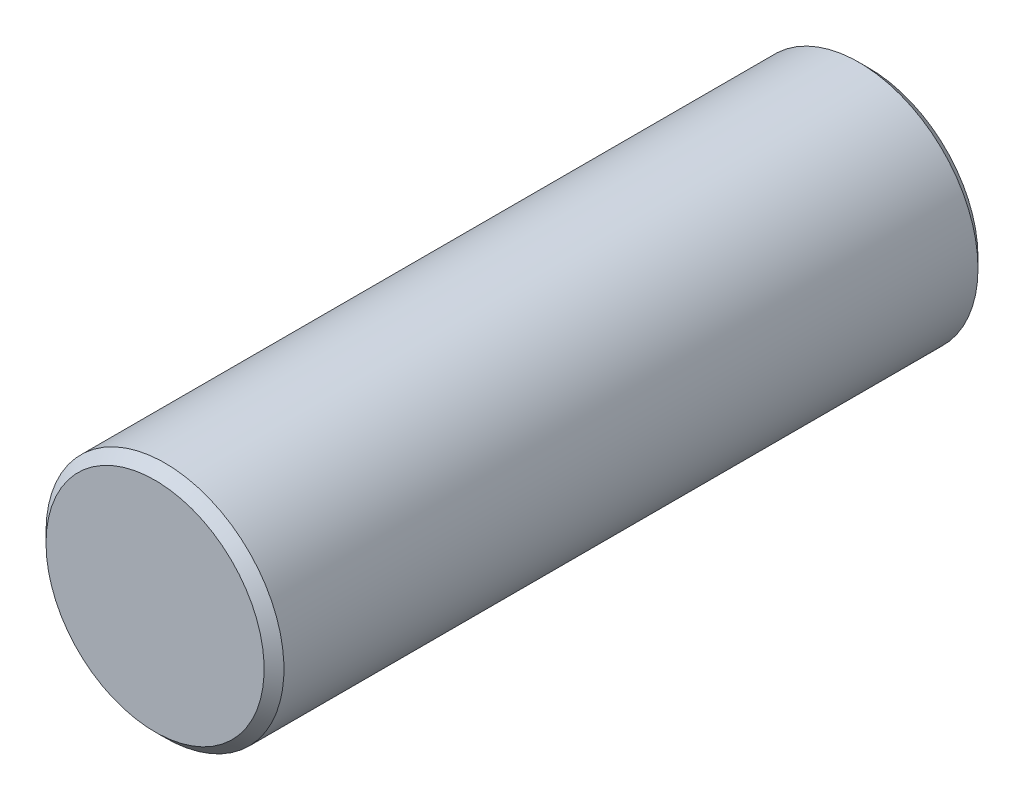
ISO-10303-21;
HEADER;
FILE_DESCRIPTION(('STEP AP214'),'2;1');
FILE_NAME('part.step','',(''),(''),'','','');
FILE_SCHEMA(('AUTOMOTIVE_DESIGN { 1 0 10303 214 1 1 1 1 }'));
ENDSEC;
DATA;
#1=APPLICATION_CONTEXT('core data for automotive mechanical design processes');
#2=APPLICATION_PROTOCOL_DEFINITION('international standard','automotive_design',2000,#1);
#3=PRODUCT_CONTEXT('',#1,'mechanical');
#4=PRODUCT('Part','Part','',(#3));
#5=PRODUCT_RELATED_PRODUCT_CATEGORY('part','',(#4));
#6=PRODUCT_DEFINITION_FORMATION('','',#4);
#7=PRODUCT_DEFINITION_CONTEXT('part definition',#1,'design');
#8=PRODUCT_DEFINITION('design','',#6,#7);
#9=PRODUCT_DEFINITION_SHAPE('','',#8);
#10=(LENGTH_UNIT() NAMED_UNIT(*) SI_UNIT(.MILLI.,.METRE.));
#11=(NAMED_UNIT(*) PLANE_ANGLE_UNIT() SI_UNIT($,.RADIAN.));
#12=(NAMED_UNIT(*) SI_UNIT($,.STERADIAN.) SOLID_ANGLE_UNIT());
#13=UNCERTAINTY_MEASURE_WITH_UNIT(LENGTH_MEASURE(1.E-05),#10,'distance_accuracy_value','');
#14=(GEOMETRIC_REPRESENTATION_CONTEXT(3) GLOBAL_UNCERTAINTY_ASSIGNED_CONTEXT((#13)) GLOBAL_UNIT_ASSIGNED_CONTEXT((#10,
#11,#12)) REPRESENTATION_CONTEXT('',''));
#15=CARTESIAN_POINT('',(0.,0.,0.));
#16=DIRECTION('',(0.,0.,1.));
#17=DIRECTION('',(1.,0.,0.));
#18=AXIS2_PLACEMENT_3D('',#15,#16,#17);
#19=CARTESIAN_POINT('',(-9.35447216320577,-4.65793415022254,4.375));
#20=DIRECTION('',(0.,0.,-1.));
#21=DIRECTION('',(-1.,0.,0.));
#22=AXIS2_PLACEMENT_3D('',#19,#20,#21);
#23=CYLINDRICAL_SURFACE('',#22,1.5);
#24=CARTESIAN_POINT('',(-9.35447216320577,-4.65793415022254,4.25));
#25=DIRECTION('',(0.,0.,-1.));
#26=DIRECTION('',(-1.,0.,0.));
#27=AXIS2_PLACEMENT_3D('',#24,#25,#26);
#28=CIRCLE('',#27,1.5);
#29=CARTESIAN_POINT('',(-10.8544721632058,-4.65793415022254,4.25));
#30=VERTEX_POINT('',#29);
#31=EDGE_CURVE('E25',#30,#30,#28,.T.);
#32=ORIENTED_EDGE('',*,*,#31,.T.);
#33=EDGE_LOOP('',(#32));
#34=FACE_BOUND('',#33,.T.);
#35=CARTESIAN_POINT('',(-9.35447216320577,-4.65793415022254,-4.5));
#36=DIRECTION('',(0.,0.,1.));
#37=DIRECTION('',(-1.,0.,0.));
#38=AXIS2_PLACEMENT_3D('',#35,#36,#37);
#39=CIRCLE('',#38,1.5);
#40=CARTESIAN_POINT('',(-10.8544721632058,-4.65793415022255,-4.5));
#41=VERTEX_POINT('',#40);
#42=EDGE_CURVE('E11',#41,#41,#39,.T.);
#43=ORIENTED_EDGE('',*,*,#42,.T.);
#44=EDGE_LOOP('',(#43));
#45=FACE_BOUND('',#44,.T.);
#46=ADVANCED_FACE('F17',(#34,#45),#23,.T.);
#47=CARTESIAN_POINT('',(-9.35447216320577,-4.65793415022253,-4.49999999997454));
#48=DIRECTION('',(0.,0.,1.));
#49=DIRECTION('',(1.,0.,0.));
#50=AXIS2_PLACEMENT_3D('',#47,#48,#49);
#51=CONICAL_SURFACE('',#50,1.50000000002137,0.78539816339745);
#52=CARTESIAN_POINT('',(-9.35447216320577,-4.65793415022253,-4.62500000005685));
#53=DIRECTION('',(0.,0.,1.));
#54=DIRECTION('',(1.,0.,0.));
#55=AXIS2_PLACEMENT_3D('',#52,#53,#54);
#56=CIRCLE('',#55,1.37499999993906);
#57=CARTESIAN_POINT('',(-7.97947216326671,-4.65793415022253,-4.62500000005685));
#58=VERTEX_POINT('',#57);
#59=EDGE_CURVE('E55',#58,#58,#56,.T.);
#60=ORIENTED_EDGE('',*,*,#59,.T.);
#61=EDGE_LOOP('',(#60));
#62=FACE_BOUND('',#61,.T.);
#63=ORIENTED_EDGE('',*,*,#42,.F.);
#64=EDGE_LOOP('',(#63));
#65=FACE_BOUND('',#64,.T.);
#66=ADVANCED_FACE('F102',(#62,#65),#51,.T.);
#67=CARTESIAN_POINT('',(-9.35447216320577,-4.65793415022254,4.24999999998909));
#68=DIRECTION('',(0.,0.,-1.));
#69=DIRECTION('',(-1.,0.,0.));
#70=AXIS2_PLACEMENT_3D('',#67,#68,#69);
#71=CONICAL_SURFACE('',#70,1.49999999996453,0.785398163170075);
#72=CARTESIAN_POINT('',(-9.35447216320577,-4.65793415022254,4.3750000000714));
#73=DIRECTION('',(0.,0.,-1.));
#74=DIRECTION('',(-1.,0.,0.));
#75=AXIS2_PLACEMENT_3D('',#72,#73,#74);
#76=CIRCLE('',#75,1.37499999993906);
#77=CARTESIAN_POINT('',(-10.7294721631448,-4.65793415022254,4.37500000007139));
#78=VERTEX_POINT('',#77);
#79=EDGE_CURVE('E50',#78,#78,#76,.T.);
#80=ORIENTED_EDGE('',*,*,#79,.T.);
#81=EDGE_LOOP('',(#80));
#82=FACE_BOUND('',#81,.T.);
#83=ORIENTED_EDGE('',*,*,#31,.F.);
#84=EDGE_LOOP('',(#83));
#85=FACE_BOUND('',#84,.T.);
#86=ADVANCED_FACE('F51',(#82,#85),#71,.T.);
#87=CARTESIAN_POINT('',(-9.35447216320577,-4.65793415022254,-4.625));
#88=DIRECTION('',(0.,0.,1.));
#89=DIRECTION('',(1.,0.,0.));
#90=AXIS2_PLACEMENT_3D('',#87,#88,#89);
#91=PLANE('',#90);
#92=ORIENTED_EDGE('',*,*,#59,.F.);
#93=EDGE_LOOP('',(#92));
#94=FACE_BOUND('',#93,.T.);
#95=ADVANCED_FACE('F84',(#94),#91,.F.);
#96=CARTESIAN_POINT('',(-9.35447216320577,-4.65793415022254,4.375));
#97=DIRECTION('',(0.,0.,1.));
#98=DIRECTION('',(1.,0.,0.));
#99=AXIS2_PLACEMENT_3D('',#96,#97,#98);
#100=PLANE('',#99);
#101=ORIENTED_EDGE('',*,*,#79,.F.);
#102=EDGE_LOOP('',(#101));
#103=FACE_BOUND('',#102,.T.);
#104=ADVANCED_FACE('F78',(#103),#100,.T.);
#105=CLOSED_SHELL('',(#46,#66,#86,#95,#104));
#106=MANIFOLD_SOLID_BREP('B1',#105);
#107=ADVANCED_BREP_SHAPE_REPRESENTATION('',(#18,#106),#14);
#108=SHAPE_DEFINITION_REPRESENTATION(#9,#107);
ENDSEC;
END-ISO-10303-21;
